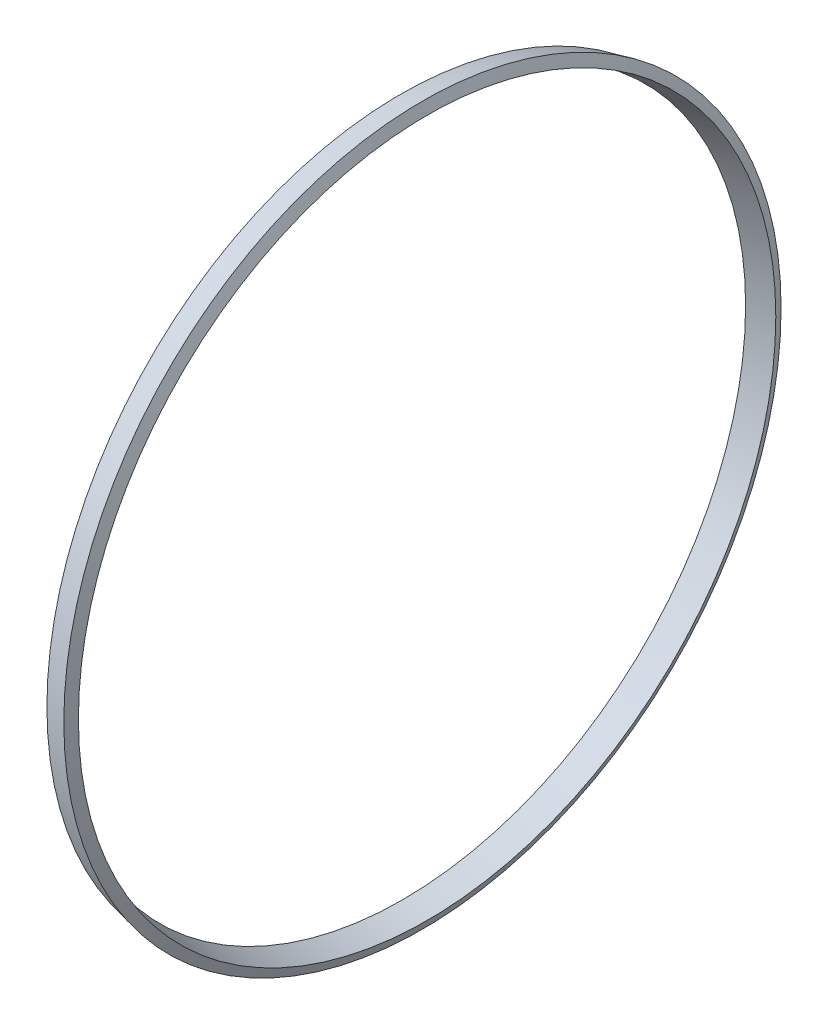
ISO-10303-21;
HEADER;
FILE_DESCRIPTION(('STEP AP214'),'2;1');
FILE_NAME('part.step','',(''),(''),'','','');
FILE_SCHEMA(('AUTOMOTIVE_DESIGN { 1 0 10303 214 1 1 1 1 }'));
ENDSEC;
DATA;
#1=APPLICATION_CONTEXT('core data for automotive mechanical design processes');
#2=APPLICATION_PROTOCOL_DEFINITION('international standard','automotive_design',2000,#1);
#3=PRODUCT_CONTEXT('',#1,'mechanical');
#4=PRODUCT('Part','Part','',(#3));
#5=PRODUCT_RELATED_PRODUCT_CATEGORY('part','',(#4));
#6=PRODUCT_DEFINITION_FORMATION('','',#4);
#7=PRODUCT_DEFINITION_CONTEXT('part definition',#1,'design');
#8=PRODUCT_DEFINITION('design','',#6,#7);
#9=PRODUCT_DEFINITION_SHAPE('','',#8);
#10=(LENGTH_UNIT() NAMED_UNIT(*) SI_UNIT(.MILLI.,.METRE.));
#11=(NAMED_UNIT(*) PLANE_ANGLE_UNIT() SI_UNIT($,.RADIAN.));
#12=(NAMED_UNIT(*) SI_UNIT($,.STERADIAN.) SOLID_ANGLE_UNIT());
#13=UNCERTAINTY_MEASURE_WITH_UNIT(LENGTH_MEASURE(1.E-05),#10,'distance_accuracy_value','');
#14=(GEOMETRIC_REPRESENTATION_CONTEXT(3) GLOBAL_UNCERTAINTY_ASSIGNED_CONTEXT((#13)) GLOBAL_UNIT_ASSIGNED_CONTEXT((#10,
#11,#12)) REPRESENTATION_CONTEXT('',''));
#15=CARTESIAN_POINT('',(0.,0.,0.));
#16=DIRECTION('',(0.,0.,1.));
#17=DIRECTION('',(1.,0.,0.));
#18=AXIS2_PLACEMENT_3D('',#15,#16,#17);
#19=CARTESIAN_POINT('',(21.0128237292337,0.,0.));
#20=DIRECTION('',(1.,0.,0.));
#21=DIRECTION('',(0.,0.,-1.));
#22=AXIS2_PLACEMENT_3D('',#19,#20,#21);
#23=CONICAL_SURFACE('',#22,37.170174561137,0.224432629534704);
#24=CARTESIAN_POINT('',(18.7443045340385,0.,-2.22044604925031E-13));
#25=DIRECTION('',(-1.,0.,0.));
#26=DIRECTION('',(0.,0.,1.));
#27=AXIS2_PLACEMENT_3D('',#24,#25,#26);
#28=CIRCLE('',#27,36.65232072846);
#29=CARTESIAN_POINT('',(18.7443045340385,0.,36.6523207284598));
#30=VERTEX_POINT('',#29);
#31=EDGE_CURVE('E27',#30,#30,#28,.F.);
#32=ORIENTED_EDGE('',*,*,#31,.T.);
#33=EDGE_LOOP('',(#32));
#34=FACE_BOUND('',#33,.T.);
#35=CARTESIAN_POINT('',(21.0128237292337,0.,0.));
#36=DIRECTION('',(-1.,0.,0.));
#37=DIRECTION('',(0.,0.,1.));
#38=AXIS2_PLACEMENT_3D('',#35,#36,#37);
#39=CIRCLE('',#38,37.170174561137);
#40=CARTESIAN_POINT('',(21.0128237292337,0.,37.170174561137));
#41=VERTEX_POINT('',#40);
#42=EDGE_CURVE('E18',#41,#41,#39,.F.);
#43=ORIENTED_EDGE('',*,*,#42,.F.);
#44=EDGE_LOOP('',(#43));
#45=FACE_BOUND('',#44,.T.);
#46=ADVANCED_FACE('F15',(#34,#45),#23,.T.);
#47=CARTESIAN_POINT('',(21.0128237292337,0.,0.));
#48=DIRECTION('',(-1.,0.,0.));
#49=DIRECTION('',(0.,0.,1.));
#50=AXIS2_PLACEMENT_3D('',#47,#48,#49);
#51=CONICAL_SURFACE('',#50,37.170174561137,1.1332176515637);
#52=CARTESIAN_POINT('',(21.4949999999996,-2.22044604925031E-13,0.));
#53=DIRECTION('',(1.,0.,0.));
#54=DIRECTION('',(0.,0.,-1.));
#55=AXIS2_PLACEMENT_3D('',#52,#53,#54);
#56=CIRCLE('',#55,36.1395);
#57=CARTESIAN_POINT('',(21.4949999999996,-2.03989297675733E-13,-36.1395));
#58=VERTEX_POINT('',#57);
#59=EDGE_CURVE('E22',#58,#58,#56,.F.);
#60=ORIENTED_EDGE('',*,*,#59,.T.);
#61=EDGE_LOOP('',(#60));
#62=FACE_BOUND('',#61,.T.);
#63=ORIENTED_EDGE('',*,*,#42,.T.);
#64=EDGE_LOOP('',(#63));
#65=FACE_BOUND('',#64,.T.);
#66=ADVANCED_FACE('F35',(#62,#65),#51,.T.);
#67=CARTESIAN_POINT('',(18.7443045340385,0.,-2.22044604925031E-13));
#68=DIRECTION('',(-1.,0.,0.));
#69=DIRECTION('',(0.,0.,1.));
#70=AXIS2_PLACEMENT_3D('',#67,#68,#69);
#71=CONICAL_SURFACE('',#70,36.65232072846,1.38261008792818);
#72=CARTESIAN_POINT('',(18.9538535767557,1.11022302462516E-13,4.44089209850063E-13));
#73=DIRECTION('',(1.,0.,0.));
#74=DIRECTION('',(0.,0.,-1.));
#75=AXIS2_PLACEMENT_3D('',#72,#73,#74);
#76=CIRCLE('',#75,35.551977136852);
#77=CARTESIAN_POINT('',(18.9538535767557,1.28784083077242E-13,-35.5519771368516));
#78=VERTEX_POINT('',#77);
#79=EDGE_CURVE('E10',#78,#78,#76,.T.);
#80=ORIENTED_EDGE('',*,*,#79,.T.);
#81=EDGE_LOOP('',(#80));
#82=FACE_BOUND('',#81,.T.);
#83=ORIENTED_EDGE('',*,*,#31,.F.);
#84=EDGE_LOOP('',(#83));
#85=FACE_BOUND('',#84,.T.);
#86=ADVANCED_FACE('F42',(#82,#85),#71,.F.);
#87=CARTESIAN_POINT('',(21.4949999999996,-2.22044604925031E-13,0.));
#88=DIRECTION('',(1.,0.,0.));
#89=DIRECTION('',(0.,0.,-1.));
#90=AXIS2_PLACEMENT_3D('',#87,#88,#89);
#91=CONICAL_SURFACE('',#90,36.1395,0.227211462807606);
#92=ORIENTED_EDGE('',*,*,#59,.F.);
#93=EDGE_LOOP('',(#92));
#94=FACE_BOUND('',#93,.T.);
#95=ORIENTED_EDGE('',*,*,#79,.F.);
#96=EDGE_LOOP('',(#95));
#97=FACE_BOUND('',#96,.T.);
#98=ADVANCED_FACE('F44',(#94,#97),#91,.F.);
#99=CLOSED_SHELL('',(#46,#66,#86,#98));
#100=MANIFOLD_SOLID_BREP('B1',#99);
#101=ADVANCED_BREP_SHAPE_REPRESENTATION('',(#18,#100),#14);
#102=SHAPE_DEFINITION_REPRESENTATION(#9,#101);
ENDSEC;
END-ISO-10303-21;
